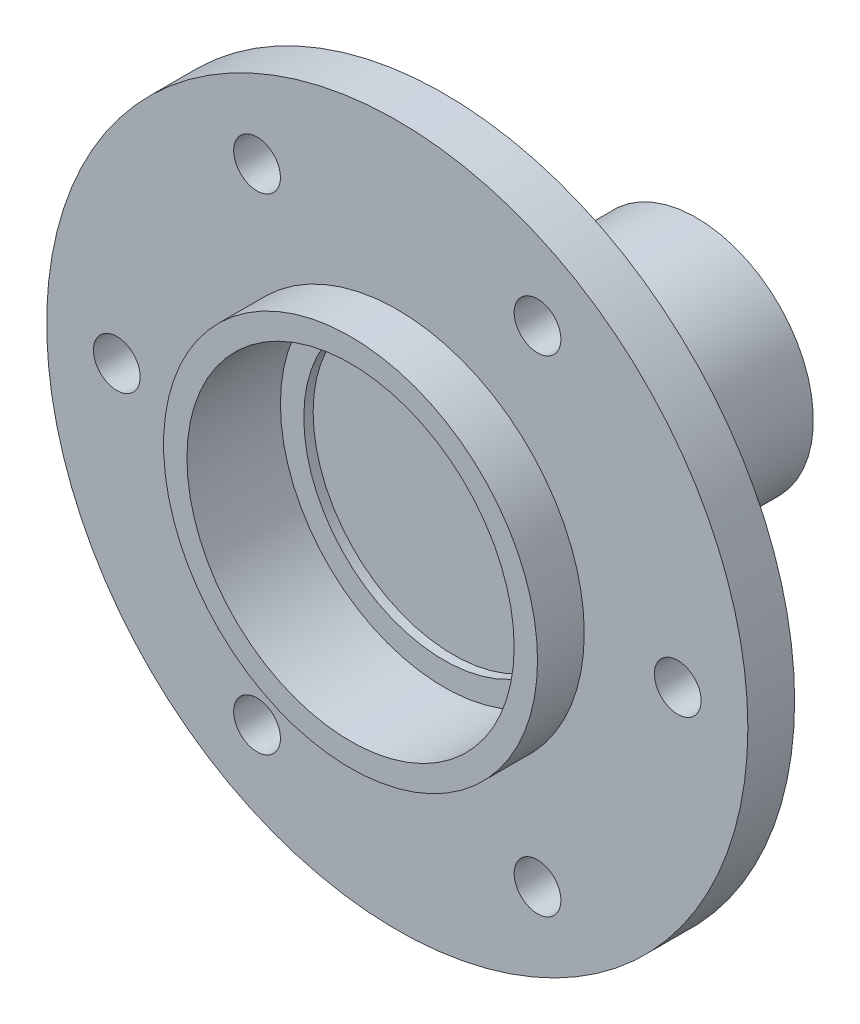
ISO-10303-21;
HEADER;
FILE_DESCRIPTION(('STEP AP214'),'2;1');
FILE_NAME('part.step','',(''),(''),'','','');
FILE_SCHEMA(('AUTOMOTIVE_DESIGN { 1 0 10303 214 1 1 1 1 }'));
ENDSEC;
DATA;
#1=APPLICATION_CONTEXT('core data for automotive mechanical design processes');
#2=APPLICATION_PROTOCOL_DEFINITION('international standard','automotive_design',2000,#1);
#3=PRODUCT_CONTEXT('',#1,'mechanical');
#4=PRODUCT('Part','Part','',(#3));
#5=PRODUCT_RELATED_PRODUCT_CATEGORY('part','',(#4));
#6=PRODUCT_DEFINITION_FORMATION('','',#4);
#7=PRODUCT_DEFINITION_CONTEXT('part definition',#1,'design');
#8=PRODUCT_DEFINITION('design','',#6,#7);
#9=PRODUCT_DEFINITION_SHAPE('','',#8);
#10=(LENGTH_UNIT() NAMED_UNIT(*) SI_UNIT(.MILLI.,.METRE.));
#11=(NAMED_UNIT(*) PLANE_ANGLE_UNIT() SI_UNIT($,.RADIAN.));
#12=(NAMED_UNIT(*) SI_UNIT($,.STERADIAN.) SOLID_ANGLE_UNIT());
#13=UNCERTAINTY_MEASURE_WITH_UNIT(LENGTH_MEASURE(1.E-05),#10,'distance_accuracy_value','');
#14=(GEOMETRIC_REPRESENTATION_CONTEXT(3) GLOBAL_UNCERTAINTY_ASSIGNED_CONTEXT((#13)) GLOBAL_UNIT_ASSIGNED_CONTEXT((#10,
#11,#12)) REPRESENTATION_CONTEXT('',''));
#15=CARTESIAN_POINT('',(0.,0.,0.));
#16=DIRECTION('',(0.,0.,1.));
#17=DIRECTION('',(1.,0.,0.));
#18=AXIS2_PLACEMENT_3D('',#15,#16,#17);
#19=CARTESIAN_POINT('',(0.,0.,-30.));
#20=DIRECTION('',(0.,0.,-1.));
#21=DIRECTION('',(-1.,0.,0.));
#22=AXIS2_PLACEMENT_3D('',#19,#20,#21);
#23=TOROIDAL_SURFACE('',#22,45.,20.);
#24=CARTESIAN_POINT('',(0.,0.,-10.));
#25=DIRECTION('',(0.,0.,-1.));
#26=DIRECTION('',(-1.,0.,0.));
#27=AXIS2_PLACEMENT_3D('',#24,#25,#26);
#28=CIRCLE('',#27,45.);
#29=CARTESIAN_POINT('',(-45.,0.,-10.));
#30=VERTEX_POINT('',#29);
#31=EDGE_CURVE('E53',#30,#30,#28,.T.);
#32=ORIENTED_EDGE('',*,*,#31,.T.);
#33=EDGE_LOOP('',(#32));
#34=FACE_BOUND('',#33,.T.);
#35=CARTESIAN_POINT('',(0.,0.,-30.));
#36=DIRECTION('',(0.,0.,-1.));
#37=DIRECTION('',(-1.,0.,0.));
#38=AXIS2_PLACEMENT_3D('',#35,#36,#37);
#39=CIRCLE('',#38,25.);
#40=CARTESIAN_POINT('',(-25.,0.,-30.));
#41=VERTEX_POINT('',#40);
#42=EDGE_CURVE('E39',#41,#41,#39,.T.);
#43=ORIENTED_EDGE('',*,*,#42,.F.);
#44=EDGE_LOOP('',(#43));
#45=FACE_BOUND('',#44,.T.);
#46=ADVANCED_FACE('F32',(#34,#45),#23,.F.);
#47=CARTESIAN_POINT('',(0.,0.,10.));
#48=DIRECTION('',(0.,0.,-1.));
#49=DIRECTION('',(-1.,0.,0.));
#50=AXIS2_PLACEMENT_3D('',#47,#48,#49);
#51=CYLINDRICAL_SURFACE('',#50,75.);
#52=CARTESIAN_POINT('',(0.,0.,10.));
#53=DIRECTION('',(0.,0.,1.));
#54=DIRECTION('',(1.,0.,0.));
#55=AXIS2_PLACEMENT_3D('',#52,#53,#54);
#56=CIRCLE('',#55,75.);
#57=CARTESIAN_POINT('',(75.,0.,10.));
#58=VERTEX_POINT('',#57);
#59=EDGE_CURVE('E59',#58,#58,#56,.T.);
#60=ORIENTED_EDGE('',*,*,#59,.F.);
#61=EDGE_LOOP('',(#60));
#62=FACE_BOUND('',#61,.T.);
#63=CARTESIAN_POINT('',(0.,0.,0.));
#64=DIRECTION('',(0.,0.,1.));
#65=DIRECTION('',(1.,0.,0.));
#66=AXIS2_PLACEMENT_3D('',#63,#64,#65);
#67=CIRCLE('',#66,75.);
#68=CARTESIAN_POINT('',(75.,0.,0.));
#69=VERTEX_POINT('',#68);
#70=EDGE_CURVE('E56',#69,#69,#67,.T.);
#71=ORIENTED_EDGE('',*,*,#70,.T.);
#72=EDGE_LOOP('',(#71));
#73=FACE_BOUND('',#72,.T.);
#74=ADVANCED_FACE('F119',(#62,#73),#51,.T.);
#75=CARTESIAN_POINT('',(0.,0.,10.));
#76=DIRECTION('',(0.,0.,1.));
#77=DIRECTION('',(1.,0.,0.));
#78=AXIS2_PLACEMENT_3D('',#75,#76,#77);
#79=PLANE('',#78);
#80=CARTESIAN_POINT('',(60.,0.,10.));
#81=DIRECTION('',(0.,0.,1.));
#82=DIRECTION('',(1.,0.,0.));
#83=AXIS2_PLACEMENT_3D('',#80,#81,#82);
#84=CIRCLE('',#83,5.);
#85=CARTESIAN_POINT('',(65.,0.,10.));
#86=VERTEX_POINT('',#85);
#87=EDGE_CURVE('E68',#86,#86,#84,.T.);
#88=ORIENTED_EDGE('',*,*,#87,.F.);
#89=EDGE_LOOP('',(#88));
#90=FACE_BOUND('',#89,.T.);
#91=CARTESIAN_POINT('',(30.,51.9615242270663,10.));
#92=DIRECTION('',(0.,0.,1.));
#93=DIRECTION('',(1.,0.,0.));
#94=AXIS2_PLACEMENT_3D('',#91,#92,#93);
#95=CIRCLE('',#94,4.99999999999979);
#96=CARTESIAN_POINT('',(34.9999999999997,51.9615242270663,10.));
#97=VERTEX_POINT('',#96);
#98=EDGE_CURVE('E281',#97,#97,#95,.T.);
#99=ORIENTED_EDGE('',*,*,#98,.F.);
#100=EDGE_LOOP('',(#99));
#101=FACE_BOUND('',#100,.T.);
#102=CARTESIAN_POINT('',(-29.9999999999995,51.9615242270666,10.));
#103=DIRECTION('',(0.,0.,1.));
#104=DIRECTION('',(1.,0.,0.));
#105=AXIS2_PLACEMENT_3D('',#102,#103,#104);
#106=CIRCLE('',#105,5.);
#107=CARTESIAN_POINT('',(-24.9999999999995,51.9615242270666,10.));
#108=VERTEX_POINT('',#107);
#109=EDGE_CURVE('E283',#108,#108,#106,.T.);
#110=ORIENTED_EDGE('',*,*,#109,.F.);
#111=EDGE_LOOP('',(#110));
#112=FACE_BOUND('',#111,.T.);
#113=CARTESIAN_POINT('',(-60.,0.,10.));
#114=DIRECTION('',(0.,0.,1.));
#115=DIRECTION('',(1.,0.,0.));
#116=AXIS2_PLACEMENT_3D('',#113,#114,#115);
#117=CIRCLE('',#116,4.99999999999988);
#118=CARTESIAN_POINT('',(-55.0000000000001,0.,10.));
#119=VERTEX_POINT('',#118);
#120=EDGE_CURVE('E287',#119,#119,#117,.T.);
#121=ORIENTED_EDGE('',*,*,#120,.F.);
#122=EDGE_LOOP('',(#121));
#123=FACE_BOUND('',#122,.T.);
#124=CARTESIAN_POINT('',(-30.0000000000002,-51.9615242270662,10.));
#125=DIRECTION('',(0.,0.,1.));
#126=DIRECTION('',(1.,0.,0.));
#127=AXIS2_PLACEMENT_3D('',#124,#125,#126);
#128=CIRCLE('',#127,5.00000000000001);
#129=CARTESIAN_POINT('',(-25.0000000000002,-51.9615242270662,10.));
#130=VERTEX_POINT('',#129);
#131=EDGE_CURVE('E278',#130,#130,#128,.T.);
#132=ORIENTED_EDGE('',*,*,#131,.F.);
#133=EDGE_LOOP('',(#132));
#134=FACE_BOUND('',#133,.T.);
#135=CARTESIAN_POINT('',(30.,-51.9615242270663,10.));
#136=DIRECTION('',(0.,0.,1.));
#137=DIRECTION('',(1.,0.,0.));
#138=AXIS2_PLACEMENT_3D('',#135,#136,#137);
#139=CIRCLE('',#138,4.99999999999996);
#140=CARTESIAN_POINT('',(35.,-51.9615242270663,10.));
#141=VERTEX_POINT('',#140);
#142=EDGE_CURVE('E276',#141,#141,#139,.T.);
#143=ORIENTED_EDGE('',*,*,#142,.F.);
#144=EDGE_LOOP('',(#143));
#145=FACE_BOUND('',#144,.T.);
#146=CARTESIAN_POINT('',(0.,0.,10.));
#147=DIRECTION('',(0.,0.,1.));
#148=DIRECTION('',(1.,0.,0.));
#149=AXIS2_PLACEMENT_3D('',#146,#147,#148);
#150=CIRCLE('',#149,40.);
#151=CARTESIAN_POINT('',(40.,0.,10.));
#152=VERTEX_POINT('',#151);
#153=EDGE_CURVE('E10',#152,#152,#150,.T.);
#154=ORIENTED_EDGE('',*,*,#153,.F.);
#155=EDGE_LOOP('',(#154));
#156=FACE_BOUND('',#155,.T.);
#157=ORIENTED_EDGE('',*,*,#59,.T.);
#158=EDGE_LOOP('',(#157));
#159=FACE_BOUND('',#158,.T.);
#160=ADVANCED_FACE('F124',(#90,#101,#112,#123,#134,#145,#156,#159),#79,.T.);
#161=CARTESIAN_POINT('',(0.,0.,0.));
#162=DIRECTION('',(0.,0.,1.));
#163=DIRECTION('',(1.,0.,0.));
#164=AXIS2_PLACEMENT_3D('',#161,#162,#163);
#165=PLANE('',#164);
#166=CARTESIAN_POINT('',(60.,0.,0.));
#167=DIRECTION('',(0.,0.,1.));
#168=DIRECTION('',(1.,0.,0.));
#169=AXIS2_PLACEMENT_3D('',#166,#167,#168);
#170=CIRCLE('',#169,5.);
#171=CARTESIAN_POINT('',(65.,0.,0.));
#172=VERTEX_POINT('',#171);
#173=EDGE_CURVE('E35',#172,#172,#170,.T.);
#174=ORIENTED_EDGE('',*,*,#173,.T.);
#175=EDGE_LOOP('',(#174));
#176=FACE_BOUND('',#175,.T.);
#177=CARTESIAN_POINT('',(30.,51.9615242270663,0.));
#178=DIRECTION('',(0.,0.,1.));
#179=DIRECTION('',(1.,0.,0.));
#180=AXIS2_PLACEMENT_3D('',#177,#178,#179);
#181=CIRCLE('',#180,4.99999999999979);
#182=CARTESIAN_POINT('',(34.9999999999997,51.9615242270663,0.));
#183=VERTEX_POINT('',#182);
#184=EDGE_CURVE('E76',#183,#183,#181,.T.);
#185=ORIENTED_EDGE('',*,*,#184,.T.);
#186=EDGE_LOOP('',(#185));
#187=FACE_BOUND('',#186,.T.);
#188=CARTESIAN_POINT('',(-29.9999999999995,51.9615242270666,0.));
#189=DIRECTION('',(0.,0.,1.));
#190=DIRECTION('',(1.,0.,0.));
#191=AXIS2_PLACEMENT_3D('',#188,#189,#190);
#192=CIRCLE('',#191,5.);
#193=CARTESIAN_POINT('',(-24.9999999999995,51.9615242270666,0.));
#194=VERTEX_POINT('',#193);
#195=EDGE_CURVE('E74',#194,#194,#192,.T.);
#196=ORIENTED_EDGE('',*,*,#195,.T.);
#197=EDGE_LOOP('',(#196));
#198=FACE_BOUND('',#197,.T.);
#199=CARTESIAN_POINT('',(-60.,0.,0.));
#200=DIRECTION('',(0.,0.,1.));
#201=DIRECTION('',(1.,0.,0.));
#202=AXIS2_PLACEMENT_3D('',#199,#200,#201);
#203=CIRCLE('',#202,4.99999999999988);
#204=CARTESIAN_POINT('',(-55.0000000000001,0.,0.));
#205=VERTEX_POINT('',#204);
#206=EDGE_CURVE('E71',#205,#205,#203,.T.);
#207=ORIENTED_EDGE('',*,*,#206,.T.);
#208=EDGE_LOOP('',(#207));
#209=FACE_BOUND('',#208,.T.);
#210=CARTESIAN_POINT('',(-30.0000000000002,-51.9615242270662,0.));
#211=DIRECTION('',(0.,0.,1.));
#212=DIRECTION('',(1.,0.,0.));
#213=AXIS2_PLACEMENT_3D('',#210,#211,#212);
#214=CIRCLE('',#213,5.00000000000001);
#215=CARTESIAN_POINT('',(-25.0000000000002,-51.9615242270662,0.));
#216=VERTEX_POINT('',#215);
#217=EDGE_CURVE('E67',#216,#216,#214,.T.);
#218=ORIENTED_EDGE('',*,*,#217,.T.);
#219=EDGE_LOOP('',(#218));
#220=FACE_BOUND('',#219,.T.);
#221=CARTESIAN_POINT('',(30.,-51.9615242270663,0.));
#222=DIRECTION('',(0.,0.,1.));
#223=DIRECTION('',(1.,0.,0.));
#224=AXIS2_PLACEMENT_3D('',#221,#222,#223);
#225=CIRCLE('',#224,4.99999999999996);
#226=CARTESIAN_POINT('',(35.,-51.9615242270663,0.));
#227=VERTEX_POINT('',#226);
#228=EDGE_CURVE('E64',#227,#227,#225,.T.);
#229=ORIENTED_EDGE('',*,*,#228,.T.);
#230=EDGE_LOOP('',(#229));
#231=FACE_BOUND('',#230,.T.);
#232=CARTESIAN_POINT('',(0.,0.,0.));
#233=DIRECTION('',(0.,0.,-1.));
#234=DIRECTION('',(-1.,0.,0.));
#235=AXIS2_PLACEMENT_3D('',#232,#233,#234);
#236=CIRCLE('',#235,45.);
#237=CARTESIAN_POINT('',(-45.,0.,0.));
#238=VERTEX_POINT('',#237);
#239=EDGE_CURVE('E44',#238,#238,#236,.T.);
#240=ORIENTED_EDGE('',*,*,#239,.F.);
#241=EDGE_LOOP('',(#240));
#242=FACE_BOUND('',#241,.T.);
#243=ORIENTED_EDGE('',*,*,#70,.F.);
#244=EDGE_LOOP('',(#243));
#245=FACE_BOUND('',#244,.T.);
#246=ADVANCED_FACE('F138',(#176,#187,#198,#209,#220,#231,#242,#245),#165,.F.);
#247=CARTESIAN_POINT('',(0.,0.,-10.));
#248=DIRECTION('',(0.,0.,1.));
#249=DIRECTION('',(1.,0.,0.));
#250=AXIS2_PLACEMENT_3D('',#247,#248,#249);
#251=CYLINDRICAL_SURFACE('',#250,45.);
#252=ORIENTED_EDGE('',*,*,#31,.F.);
#253=EDGE_LOOP('',(#252));
#254=FACE_BOUND('',#253,.T.);
#255=ORIENTED_EDGE('',*,*,#239,.T.);
#256=EDGE_LOOP('',(#255));
#257=FACE_BOUND('',#256,.T.);
#258=ADVANCED_FACE('F132',(#254,#257),#251,.T.);
#259=CARTESIAN_POINT('',(0.,0.,-54.));
#260=DIRECTION('',(0.,0.,1.));
#261=DIRECTION('',(1.,0.,0.));
#262=AXIS2_PLACEMENT_3D('',#259,#260,#261);
#263=CYLINDRICAL_SURFACE('',#262,25.);
#264=ORIENTED_EDGE('',*,*,#42,.T.);
#265=EDGE_LOOP('',(#264));
#266=FACE_BOUND('',#265,.T.);
#267=CARTESIAN_POINT('',(0.,0.,-54.));
#268=DIRECTION('',(0.,0.,-1.));
#269=DIRECTION('',(-1.,0.,0.));
#270=AXIS2_PLACEMENT_3D('',#267,#268,#269);
#271=CIRCLE('',#270,25.);
#272=CARTESIAN_POINT('',(-25.,0.,-54.));
#273=VERTEX_POINT('',#272);
#274=EDGE_CURVE('E50',#273,#273,#271,.T.);
#275=ORIENTED_EDGE('',*,*,#274,.F.);
#276=EDGE_LOOP('',(#275));
#277=FACE_BOUND('',#276,.T.);
#278=ADVANCED_FACE('F115',(#266,#277),#263,.T.);
#279=CARTESIAN_POINT('',(0.,0.,-54.));
#280=DIRECTION('',(0.,0.,-1.));
#281=DIRECTION('',(-1.,0.,0.));
#282=AXIS2_PLACEMENT_3D('',#279,#280,#281);
#283=PLANE('',#282);
#284=ORIENTED_EDGE('',*,*,#274,.T.);
#285=EDGE_LOOP('',(#284));
#286=FACE_BOUND('',#285,.T.);
#287=ADVANCED_FACE('F110',(#286),#283,.T.);
#288=CARTESIAN_POINT('',(0.,0.,20.));
#289=DIRECTION('',(0.,0.,-1.));
#290=DIRECTION('',(-1.,0.,0.));
#291=AXIS2_PLACEMENT_3D('',#288,#289,#290);
#292=CYLINDRICAL_SURFACE('',#291,40.);
#293=CARTESIAN_POINT('',(0.,0.,20.));
#294=DIRECTION('',(0.,0.,1.));
#295=DIRECTION('',(1.,0.,0.));
#296=AXIS2_PLACEMENT_3D('',#293,#294,#295);
#297=CIRCLE('',#296,40.);
#298=CARTESIAN_POINT('',(40.,0.,20.));
#299=VERTEX_POINT('',#298);
#300=EDGE_CURVE('E48',#299,#299,#297,.T.);
#301=ORIENTED_EDGE('',*,*,#300,.F.);
#302=EDGE_LOOP('',(#301));
#303=FACE_BOUND('',#302,.T.);
#304=ORIENTED_EDGE('',*,*,#153,.T.);
#305=EDGE_LOOP('',(#304));
#306=FACE_BOUND('',#305,.T.);
#307=ADVANCED_FACE('F104',(#303,#306),#292,.T.);
#308=CARTESIAN_POINT('',(0.,0.,20.));
#309=DIRECTION('',(0.,0.,1.));
#310=DIRECTION('',(1.,0.,0.));
#311=AXIS2_PLACEMENT_3D('',#308,#309,#310);
#312=PLANE('',#311);
#313=CARTESIAN_POINT('',(0.,0.,20.));
#314=DIRECTION('',(0.,0.,1.));
#315=DIRECTION('',(1.,0.,0.));
#316=AXIS2_PLACEMENT_3D('',#313,#314,#315);
#317=CIRCLE('',#316,35.);
#318=CARTESIAN_POINT('',(35.,0.,20.));
#319=VERTEX_POINT('',#318);
#320=EDGE_CURVE('E90',#319,#319,#317,.T.);
#321=ORIENTED_EDGE('',*,*,#320,.F.);
#322=EDGE_LOOP('',(#321));
#323=FACE_BOUND('',#322,.T.);
#324=ORIENTED_EDGE('',*,*,#300,.T.);
#325=EDGE_LOOP('',(#324));
#326=FACE_BOUND('',#325,.T.);
#327=ADVANCED_FACE('F101',(#323,#326),#312,.T.);
#328=CARTESIAN_POINT('',(0.,0.,0.));
#329=DIRECTION('',(0.,0.,1.));
#330=DIRECTION('',(1.,0.,0.));
#331=AXIS2_PLACEMENT_3D('',#328,#329,#330);
#332=CYLINDRICAL_SURFACE('',#331,35.);
#333=CARTESIAN_POINT('',(0.,0.,0.));
#334=DIRECTION('',(0.,0.,1.));
#335=DIRECTION('',(1.,0.,0.));
#336=AXIS2_PLACEMENT_3D('',#333,#334,#335);
#337=CIRCLE('',#336,35.);
#338=CARTESIAN_POINT('',(35.,0.,0.));
#339=VERTEX_POINT('',#338);
#340=EDGE_CURVE('E94',#339,#339,#337,.T.);
#341=ORIENTED_EDGE('',*,*,#340,.F.);
#342=EDGE_LOOP('',(#341));
#343=FACE_BOUND('',#342,.T.);
#344=ORIENTED_EDGE('',*,*,#320,.T.);
#345=EDGE_LOOP('',(#344));
#346=FACE_BOUND('',#345,.T.);
#347=ADVANCED_FACE('F99',(#343,#346),#332,.F.);
#348=CARTESIAN_POINT('',(0.,0.,0.));
#349=DIRECTION('',(0.,0.,1.));
#350=DIRECTION('',(1.,0.,0.));
#351=AXIS2_PLACEMENT_3D('',#348,#349,#350);
#352=PLANE('',#351);
#353=CARTESIAN_POINT('',(0.,0.,0.));
#354=DIRECTION('',(0.,0.,1.));
#355=DIRECTION('',(1.,0.,0.));
#356=AXIS2_PLACEMENT_3D('',#353,#354,#355);
#357=CIRCLE('',#356,30.);
#358=CARTESIAN_POINT('',(30.,0.,0.));
#359=VERTEX_POINT('',#358);
#360=EDGE_CURVE('E81',#359,#359,#357,.T.);
#361=ORIENTED_EDGE('',*,*,#360,.F.);
#362=EDGE_LOOP('',(#361));
#363=FACE_BOUND('',#362,.T.);
#364=ORIENTED_EDGE('',*,*,#340,.T.);
#365=EDGE_LOOP('',(#364));
#366=FACE_BOUND('',#365,.T.);
#367=ADVANCED_FACE('F193',(#363,#366),#352,.T.);
#368=CARTESIAN_POINT('',(0.,0.,-2.));
#369=DIRECTION('',(0.,0.,1.));
#370=DIRECTION('',(1.,0.,0.));
#371=AXIS2_PLACEMENT_3D('',#368,#369,#370);
#372=CYLINDRICAL_SURFACE('',#371,30.);
#373=CARTESIAN_POINT('',(0.,0.,-2.));
#374=DIRECTION('',(0.,0.,1.));
#375=DIRECTION('',(1.,0.,0.));
#376=AXIS2_PLACEMENT_3D('',#373,#374,#375);
#377=CIRCLE('',#376,30.);
#378=CARTESIAN_POINT('',(30.,0.,-2.));
#379=VERTEX_POINT('',#378);
#380=EDGE_CURVE('E85',#379,#379,#377,.T.);
#381=ORIENTED_EDGE('',*,*,#380,.F.);
#382=EDGE_LOOP('',(#381));
#383=FACE_BOUND('',#382,.T.);
#384=ORIENTED_EDGE('',*,*,#360,.T.);
#385=EDGE_LOOP('',(#384));
#386=FACE_BOUND('',#385,.T.);
#387=ADVANCED_FACE('F176',(#383,#386),#372,.F.);
#388=CARTESIAN_POINT('',(0.,0.,-2.));
#389=DIRECTION('',(0.,0.,1.));
#390=DIRECTION('',(1.,0.,0.));
#391=AXIS2_PLACEMENT_3D('',#388,#389,#390);
#392=PLANE('',#391);
#393=ORIENTED_EDGE('',*,*,#380,.T.);
#394=EDGE_LOOP('',(#393));
#395=FACE_BOUND('',#394,.T.);
#396=ADVANCED_FACE('F166',(#395),#392,.T.);
#397=CARTESIAN_POINT('',(30.,-51.9615242270663,-54.));
#398=DIRECTION('',(0.,0.,1.));
#399=DIRECTION('',(1.,0.,0.));
#400=AXIS2_PLACEMENT_3D('',#397,#398,#399);
#401=CYLINDRICAL_SURFACE('',#400,4.99999999999996);
#402=ORIENTED_EDGE('',*,*,#142,.T.);
#403=EDGE_LOOP('',(#402));
#404=FACE_BOUND('',#403,.T.);
#405=ORIENTED_EDGE('',*,*,#228,.F.);
#406=EDGE_LOOP('',(#405));
#407=FACE_BOUND('',#406,.T.);
#408=ADVANCED_FACE('F163',(#404,#407),#401,.F.);
#409=CARTESIAN_POINT('',(-30.0000000000002,-51.9615242270662,-54.));
#410=DIRECTION('',(0.,0.,1.));
#411=DIRECTION('',(1.,0.,0.));
#412=AXIS2_PLACEMENT_3D('',#409,#410,#411);
#413=CYLINDRICAL_SURFACE('',#412,5.00000000000001);
#414=ORIENTED_EDGE('',*,*,#131,.T.);
#415=EDGE_LOOP('',(#414));
#416=FACE_BOUND('',#415,.T.);
#417=ORIENTED_EDGE('',*,*,#217,.F.);
#418=EDGE_LOOP('',(#417));
#419=FACE_BOUND('',#418,.T.);
#420=ADVANCED_FACE('F165',(#416,#419),#413,.F.);
#421=CARTESIAN_POINT('',(-60.,0.,-54.));
#422=DIRECTION('',(0.,0.,1.));
#423=DIRECTION('',(1.,0.,0.));
#424=AXIS2_PLACEMENT_3D('',#421,#422,#423);
#425=CYLINDRICAL_SURFACE('',#424,4.99999999999988);
#426=ORIENTED_EDGE('',*,*,#120,.T.);
#427=EDGE_LOOP('',(#426));
#428=FACE_BOUND('',#427,.T.);
#429=ORIENTED_EDGE('',*,*,#206,.F.);
#430=EDGE_LOOP('',(#429));
#431=FACE_BOUND('',#430,.T.);
#432=ADVANCED_FACE('F173',(#428,#431),#425,.F.);
#433=CARTESIAN_POINT('',(-29.9999999999995,51.9615242270666,-54.));
#434=DIRECTION('',(0.,0.,1.));
#435=DIRECTION('',(1.,0.,0.));
#436=AXIS2_PLACEMENT_3D('',#433,#434,#435);
#437=CYLINDRICAL_SURFACE('',#436,5.);
#438=ORIENTED_EDGE('',*,*,#109,.T.);
#439=EDGE_LOOP('',(#438));
#440=FACE_BOUND('',#439,.T.);
#441=ORIENTED_EDGE('',*,*,#195,.F.);
#442=EDGE_LOOP('',(#441));
#443=FACE_BOUND('',#442,.T.);
#444=ADVANCED_FACE('F186',(#440,#443),#437,.F.);
#445=CARTESIAN_POINT('',(30.,51.9615242270663,-54.));
#446=DIRECTION('',(0.,0.,1.));
#447=DIRECTION('',(1.,0.,0.));
#448=AXIS2_PLACEMENT_3D('',#445,#446,#447);
#449=CYLINDRICAL_SURFACE('',#448,4.99999999999979);
#450=ORIENTED_EDGE('',*,*,#98,.T.);
#451=EDGE_LOOP('',(#450));
#452=FACE_BOUND('',#451,.T.);
#453=ORIENTED_EDGE('',*,*,#184,.F.);
#454=EDGE_LOOP('',(#453));
#455=FACE_BOUND('',#454,.T.);
#456=ADVANCED_FACE('F181',(#452,#455),#449,.F.);
#457=CARTESIAN_POINT('',(60.,0.,-54.));
#458=DIRECTION('',(0.,0.,1.));
#459=DIRECTION('',(1.,0.,0.));
#460=AXIS2_PLACEMENT_3D('',#457,#458,#459);
#461=CYLINDRICAL_SURFACE('',#460,5.);
#462=ORIENTED_EDGE('',*,*,#87,.T.);
#463=EDGE_LOOP('',(#462));
#464=FACE_BOUND('',#463,.T.);
#465=ORIENTED_EDGE('',*,*,#173,.F.);
#466=EDGE_LOOP('',(#465));
#467=FACE_BOUND('',#466,.T.);
#468=ADVANCED_FACE('F261',(#464,#467),#461,.F.);
#469=CLOSED_SHELL('',(#46,#74,#160,#246,#258,#278,#287,#307,#327,#347,#367,#387,#396,#408,#420,
#432,#444,#456,#468));
#470=MANIFOLD_SOLID_BREP('B2',#469);
#471=ADVANCED_BREP_SHAPE_REPRESENTATION('',(#18,#470),#14);
#472=SHAPE_DEFINITION_REPRESENTATION(#9,#471);
ENDSEC;
END-ISO-10303-21;
